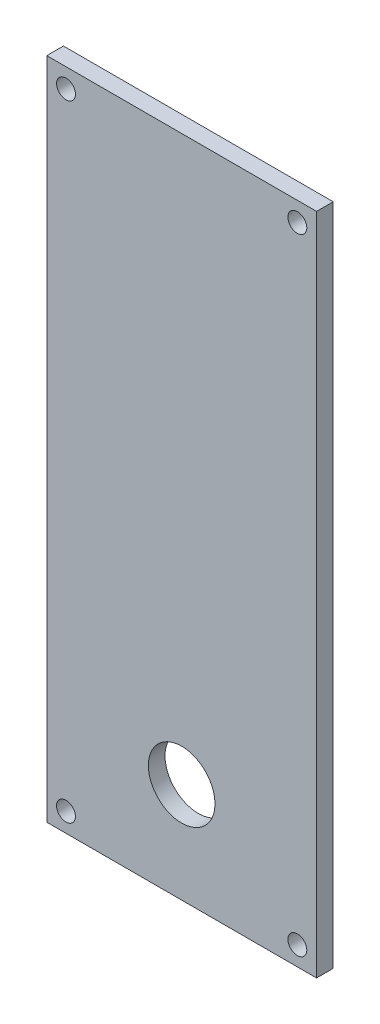
ISO-10303-21;
HEADER;
FILE_DESCRIPTION(('STEP AP214'),'2;1');
FILE_NAME('part.step','',(''),(''),'','','');
FILE_SCHEMA(('AUTOMOTIVE_DESIGN { 1 0 10303 214 1 1 1 1 }'));
ENDSEC;
DATA;
#1=APPLICATION_CONTEXT('core data for automotive mechanical design processes');
#2=APPLICATION_PROTOCOL_DEFINITION('international standard','automotive_design',2000,#1);
#3=PRODUCT_CONTEXT('',#1,'mechanical');
#4=PRODUCT('Part','Part','',(#3));
#5=PRODUCT_RELATED_PRODUCT_CATEGORY('part','',(#4));
#6=PRODUCT_DEFINITION_FORMATION('','',#4);
#7=PRODUCT_DEFINITION_CONTEXT('part definition',#1,'design');
#8=PRODUCT_DEFINITION('design','',#6,#7);
#9=PRODUCT_DEFINITION_SHAPE('','',#8);
#10=(LENGTH_UNIT() NAMED_UNIT(*) SI_UNIT(.MILLI.,.METRE.));
#11=(NAMED_UNIT(*) PLANE_ANGLE_UNIT() SI_UNIT($,.RADIAN.));
#12=(NAMED_UNIT(*) SI_UNIT($,.STERADIAN.) SOLID_ANGLE_UNIT());
#13=UNCERTAINTY_MEASURE_WITH_UNIT(LENGTH_MEASURE(1.E-05),#10,'distance_accuracy_value','');
#14=(GEOMETRIC_REPRESENTATION_CONTEXT(3) GLOBAL_UNCERTAINTY_ASSIGNED_CONTEXT((#13)) GLOBAL_UNIT_ASSIGNED_CONTEXT((#10,
#11,#12)) REPRESENTATION_CONTEXT('',''));
#15=CARTESIAN_POINT('',(0.,0.,0.));
#16=DIRECTION('',(0.,0.,1.));
#17=DIRECTION('',(1.,0.,0.));
#18=AXIS2_PLACEMENT_3D('',#15,#16,#17);
#19=CARTESIAN_POINT('',(204.8,59.8,132.097327625323));
#20=DIRECTION('',(1.,0.,0.));
#21=DIRECTION('',(0.,0.,-1.));
#22=AXIS2_PLACEMENT_3D('',#19,#20,#21);
#23=PLANE('',#22);
#24=DIRECTION('',(0.,1.,0.));
#25=VECTOR('',#24,1.);
#26=CARTESIAN_POINT('',(204.8,59.8,3.));
#27=LINE('',#26,#25);
#28=CARTESIAN_POINT('',(204.8,-59.8,3.));
#29=VERTEX_POINT('',#28);
#30=CARTESIAN_POINT('',(204.8,59.8,3.));
#31=VERTEX_POINT('',#30);
#32=EDGE_CURVE('E52',#29,#31,#27,.T.);
#33=ORIENTED_EDGE('',*,*,#32,.F.);
#34=DIRECTION('',(0.,0.,-1.));
#35=VECTOR('',#34,1.);
#36=CARTESIAN_POINT('',(204.8,-59.8,132.097327625323));
#37=LINE('',#36,#35);
#38=CARTESIAN_POINT('',(204.8,-59.8,0.));
#39=VERTEX_POINT('',#38);
#40=EDGE_CURVE('E81',#29,#39,#37,.T.);
#41=ORIENTED_EDGE('',*,*,#40,.T.);
#42=DIRECTION('',(0.,-1.,0.));
#43=VECTOR('',#42,1.);
#44=CARTESIAN_POINT('',(204.8,59.8,0.));
#45=LINE('',#44,#43);
#46=CARTESIAN_POINT('',(204.8,59.8,0.));
#47=VERTEX_POINT('',#46);
#48=EDGE_CURVE('E85',#47,#39,#45,.T.);
#49=ORIENTED_EDGE('',*,*,#48,.F.);
#50=DIRECTION('',(0.,0.,-1.));
#51=VECTOR('',#50,1.);
#52=CARTESIAN_POINT('',(204.8,59.8,132.097327625323));
#53=LINE('',#52,#51);
#54=EDGE_CURVE('E113',#31,#47,#53,.T.);
#55=ORIENTED_EDGE('',*,*,#54,.F.);
#56=EDGE_LOOP('',(#33,#41,#49,#55));
#57=FACE_BOUND('',#56,.T.);
#58=ADVANCED_FACE('F43',(#57),#23,.T.);
#59=CARTESIAN_POINT('',(156.2,59.8,132.097327625323));
#60=DIRECTION('',(0.,1.,0.));
#61=DIRECTION('',(0.,0.,1.));
#62=AXIS2_PLACEMENT_3D('',#59,#60,#61);
#63=PLANE('',#62);
#64=DIRECTION('',(-1.,0.,0.));
#65=VECTOR('',#64,1.);
#66=CARTESIAN_POINT('',(156.2,59.8,3.));
#67=LINE('',#66,#65);
#68=CARTESIAN_POINT('',(156.2,59.8,3.));
#69=VERTEX_POINT('',#68);
#70=EDGE_CURVE('E59',#31,#69,#67,.T.);
#71=ORIENTED_EDGE('',*,*,#70,.F.);
#72=ORIENTED_EDGE('',*,*,#54,.T.);
#73=DIRECTION('',(1.,0.,0.));
#74=VECTOR('',#73,1.);
#75=CARTESIAN_POINT('',(156.2,59.8,0.));
#76=LINE('',#75,#74);
#77=CARTESIAN_POINT('',(156.2,59.8,0.));
#78=VERTEX_POINT('',#77);
#79=EDGE_CURVE('E90',#78,#47,#76,.T.);
#80=ORIENTED_EDGE('',*,*,#79,.F.);
#81=DIRECTION('',(0.,0.,-1.));
#82=VECTOR('',#81,1.);
#83=CARTESIAN_POINT('',(156.2,59.8,132.097327625323));
#84=LINE('',#83,#82);
#85=EDGE_CURVE('E116',#69,#78,#84,.T.);
#86=ORIENTED_EDGE('',*,*,#85,.F.);
#87=EDGE_LOOP('',(#71,#72,#80,#86));
#88=FACE_BOUND('',#87,.T.);
#89=ADVANCED_FACE('F142',(#88),#63,.T.);
#90=CARTESIAN_POINT('',(156.2,59.8,132.097327625323));
#91=DIRECTION('',(-1.,0.,0.));
#92=DIRECTION('',(0.,0.,1.));
#93=AXIS2_PLACEMENT_3D('',#90,#91,#92);
#94=PLANE('',#93);
#95=DIRECTION('',(0.,-1.,0.));
#96=VECTOR('',#95,1.);
#97=CARTESIAN_POINT('',(156.2,59.8,3.));
#98=LINE('',#97,#96);
#99=CARTESIAN_POINT('',(156.2,-59.8,3.));
#100=VERTEX_POINT('',#99);
#101=EDGE_CURVE('E115',#69,#100,#98,.T.);
#102=ORIENTED_EDGE('',*,*,#101,.F.);
#103=ORIENTED_EDGE('',*,*,#85,.T.);
#104=DIRECTION('',(0.,1.,0.));
#105=VECTOR('',#104,1.);
#106=CARTESIAN_POINT('',(156.2,59.8,0.));
#107=LINE('',#106,#105);
#108=CARTESIAN_POINT('',(156.2,-59.8,0.));
#109=VERTEX_POINT('',#108);
#110=EDGE_CURVE('E99',#109,#78,#107,.T.);
#111=ORIENTED_EDGE('',*,*,#110,.F.);
#112=DIRECTION('',(0.,0.,-1.));
#113=VECTOR('',#112,1.);
#114=CARTESIAN_POINT('',(156.2,-59.8,132.097327625323));
#115=LINE('',#114,#113);
#116=EDGE_CURVE('E89',#100,#109,#115,.T.);
#117=ORIENTED_EDGE('',*,*,#116,.F.);
#118=EDGE_LOOP('',(#102,#103,#111,#117));
#119=FACE_BOUND('',#118,.T.);
#120=ADVANCED_FACE('F144',(#119),#94,.T.);
#121=CARTESIAN_POINT('',(204.8,-59.8,132.097327625323));
#122=DIRECTION('',(0.,-1.,0.));
#123=DIRECTION('',(1.,0.,0.));
#124=AXIS2_PLACEMENT_3D('',#121,#122,#123);
#125=PLANE('',#124);
#126=DIRECTION('',(1.,0.,0.));
#127=VECTOR('',#126,1.);
#128=CARTESIAN_POINT('',(204.8,-59.8,3.));
#129=LINE('',#128,#127);
#130=EDGE_CURVE('E11',#100,#29,#129,.T.);
#131=ORIENTED_EDGE('',*,*,#130,.F.);
#132=ORIENTED_EDGE('',*,*,#116,.T.);
#133=DIRECTION('',(-1.,0.,0.));
#134=VECTOR('',#133,1.);
#135=CARTESIAN_POINT('',(204.8,-59.8,0.));
#136=LINE('',#135,#134);
#137=EDGE_CURVE('E93',#39,#109,#136,.T.);
#138=ORIENTED_EDGE('',*,*,#137,.F.);
#139=ORIENTED_EDGE('',*,*,#40,.F.);
#140=EDGE_LOOP('',(#131,#132,#138,#139));
#141=FACE_BOUND('',#140,.T.);
#142=ADVANCED_FACE('F94',(#141),#125,.T.);
#143=CARTESIAN_POINT('',(0.,0.,0.));
#144=DIRECTION('',(0.,0.,-1.));
#145=DIRECTION('',(-1.,0.,0.));
#146=AXIS2_PLACEMENT_3D('',#143,#144,#145);
#147=PLANE('',#146);
#148=CARTESIAN_POINT('',(159.661165235168,56.3388347648319,0.));
#149=DIRECTION('',(0.,0.,-1.));
#150=DIRECTION('',(-1.,0.,0.));
#151=AXIS2_PLACEMENT_3D('',#148,#149,#150);
#152=CIRCLE('',#151,1.70000000000001);
#153=CARTESIAN_POINT('',(157.961165235168,56.3388347648319,0.));
#154=VERTEX_POINT('',#153);
#155=EDGE_CURVE('E244',#154,#154,#152,.T.);
#156=ORIENTED_EDGE('',*,*,#155,.F.);
#157=EDGE_LOOP('',(#156));
#158=FACE_BOUND('',#157,.T.);
#159=CARTESIAN_POINT('',(159.661165235168,-56.3388347648319,0.));
#160=DIRECTION('',(0.,0.,-1.));
#161=DIRECTION('',(-1.,0.,0.));
#162=AXIS2_PLACEMENT_3D('',#159,#160,#161);
#163=CIRCLE('',#162,1.70000000000001);
#164=CARTESIAN_POINT('',(157.961165235168,-56.3388347648319,0.));
#165=VERTEX_POINT('',#164);
#166=EDGE_CURVE('E245',#165,#165,#163,.T.);
#167=ORIENTED_EDGE('',*,*,#166,.F.);
#168=EDGE_LOOP('',(#167));
#169=FACE_BOUND('',#168,.T.);
#170=CARTESIAN_POINT('',(201.338834764832,-56.3388347648319,0.));
#171=DIRECTION('',(0.,0.,-1.));
#172=DIRECTION('',(-1.,0.,0.));
#173=AXIS2_PLACEMENT_3D('',#170,#171,#172);
#174=CIRCLE('',#173,1.70000000000001);
#175=CARTESIAN_POINT('',(199.638834764832,-56.3388347648319,0.));
#176=VERTEX_POINT('',#175);
#177=EDGE_CURVE('E247',#176,#176,#174,.T.);
#178=ORIENTED_EDGE('',*,*,#177,.F.);
#179=EDGE_LOOP('',(#178));
#180=FACE_BOUND('',#179,.T.);
#181=CARTESIAN_POINT('',(201.338834764832,56.3388347648319,0.));
#182=DIRECTION('',(0.,0.,-1.));
#183=DIRECTION('',(-1.,0.,0.));
#184=AXIS2_PLACEMENT_3D('',#181,#182,#183);
#185=CIRCLE('',#184,1.70000000000001);
#186=CARTESIAN_POINT('',(199.638834764832,56.3388347648319,0.));
#187=VERTEX_POINT('',#186);
#188=EDGE_CURVE('E123',#187,#187,#185,.T.);
#189=ORIENTED_EDGE('',*,*,#188,.F.);
#190=EDGE_LOOP('',(#189));
#191=FACE_BOUND('',#190,.T.);
#192=CARTESIAN_POINT('',(180.5,-41.786923320957,0.));
#193=DIRECTION('',(0.,0.,-1.));
#194=DIRECTION('',(-1.,0.,0.));
#195=AXIS2_PLACEMENT_3D('',#192,#193,#194);
#196=CIRCLE('',#195,6.00000000000002);
#197=CARTESIAN_POINT('',(174.5,-41.786923320957,0.));
#198=VERTEX_POINT('',#197);
#199=EDGE_CURVE('E106',#198,#198,#196,.T.);
#200=ORIENTED_EDGE('',*,*,#199,.F.);
#201=EDGE_LOOP('',(#200));
#202=FACE_BOUND('',#201,.T.);
#203=ORIENTED_EDGE('',*,*,#48,.T.);
#204=ORIENTED_EDGE('',*,*,#137,.T.);
#205=ORIENTED_EDGE('',*,*,#110,.T.);
#206=ORIENTED_EDGE('',*,*,#79,.T.);
#207=EDGE_LOOP('',(#203,#204,#205,#206));
#208=FACE_BOUND('',#207,.T.);
#209=ADVANCED_FACE('F101',(#158,#169,#180,#191,#202,#208),#147,.T.);
#210=CARTESIAN_POINT('',(0.,0.,3.));
#211=DIRECTION('',(0.,0.,-1.));
#212=DIRECTION('',(-1.,0.,0.));
#213=AXIS2_PLACEMENT_3D('',#210,#211,#212);
#214=PLANE('',#213);
#215=CARTESIAN_POINT('',(159.661165235168,56.3388347648319,3.));
#216=DIRECTION('',(0.,0.,-1.));
#217=DIRECTION('',(-1.,0.,0.));
#218=AXIS2_PLACEMENT_3D('',#215,#216,#217);
#219=CIRCLE('',#218,1.70000000000001);
#220=CARTESIAN_POINT('',(157.961165235168,56.3388347648319,3.));
#221=VERTEX_POINT('',#220);
#222=EDGE_CURVE('E46',#221,#221,#219,.T.);
#223=ORIENTED_EDGE('',*,*,#222,.T.);
#224=EDGE_LOOP('',(#223));
#225=FACE_BOUND('',#224,.T.);
#226=CARTESIAN_POINT('',(159.661165235168,-56.3388347648319,3.));
#227=DIRECTION('',(0.,0.,-1.));
#228=DIRECTION('',(-1.,0.,0.));
#229=AXIS2_PLACEMENT_3D('',#226,#227,#228);
#230=CIRCLE('',#229,1.70000000000001);
#231=CARTESIAN_POINT('',(157.961165235168,-56.3388347648319,3.));
#232=VERTEX_POINT('',#231);
#233=EDGE_CURVE('E125',#232,#232,#230,.T.);
#234=ORIENTED_EDGE('',*,*,#233,.T.);
#235=EDGE_LOOP('',(#234));
#236=FACE_BOUND('',#235,.T.);
#237=CARTESIAN_POINT('',(201.338834764832,-56.3388347648319,3.));
#238=DIRECTION('',(0.,0.,-1.));
#239=DIRECTION('',(-1.,0.,0.));
#240=AXIS2_PLACEMENT_3D('',#237,#238,#239);
#241=CIRCLE('',#240,1.70000000000001);
#242=CARTESIAN_POINT('',(199.638834764832,-56.3388347648319,3.));
#243=VERTEX_POINT('',#242);
#244=EDGE_CURVE('E122',#243,#243,#241,.T.);
#245=ORIENTED_EDGE('',*,*,#244,.T.);
#246=EDGE_LOOP('',(#245));
#247=FACE_BOUND('',#246,.T.);
#248=CARTESIAN_POINT('',(201.338834764832,56.3388347648319,3.));
#249=DIRECTION('',(0.,0.,-1.));
#250=DIRECTION('',(-1.,0.,0.));
#251=AXIS2_PLACEMENT_3D('',#248,#249,#250);
#252=CIRCLE('',#251,1.70000000000001);
#253=CARTESIAN_POINT('',(199.638834764832,56.3388347648319,3.));
#254=VERTEX_POINT('',#253);
#255=EDGE_CURVE('E119',#254,#254,#252,.T.);
#256=ORIENTED_EDGE('',*,*,#255,.T.);
#257=EDGE_LOOP('',(#256));
#258=FACE_BOUND('',#257,.T.);
#259=CARTESIAN_POINT('',(180.5,-41.786923320957,3.));
#260=DIRECTION('',(0.,0.,-1.));
#261=DIRECTION('',(-1.,0.,0.));
#262=AXIS2_PLACEMENT_3D('',#259,#260,#261);
#263=CIRCLE('',#262,6.00000000000002);
#264=CARTESIAN_POINT('',(174.5,-41.786923320957,3.));
#265=VERTEX_POINT('',#264);
#266=EDGE_CURVE('E103',#265,#265,#263,.T.);
#267=ORIENTED_EDGE('',*,*,#266,.T.);
#268=EDGE_LOOP('',(#267));
#269=FACE_BOUND('',#268,.T.);
#270=ORIENTED_EDGE('',*,*,#32,.T.);
#271=ORIENTED_EDGE('',*,*,#70,.T.);
#272=ORIENTED_EDGE('',*,*,#101,.T.);
#273=ORIENTED_EDGE('',*,*,#130,.T.);
#274=EDGE_LOOP('',(#270,#271,#272,#273));
#275=FACE_BOUND('',#274,.T.);
#276=ADVANCED_FACE('F139',(#225,#236,#247,#258,#269,#275),#214,.F.);
#277=CARTESIAN_POINT('',(180.5,-41.786923320957,5.));
#278=DIRECTION('',(0.,0.,-1.));
#279=DIRECTION('',(-1.,0.,0.));
#280=AXIS2_PLACEMENT_3D('',#277,#278,#279);
#281=CYLINDRICAL_SURFACE('',#280,6.00000000000002);
#282=ORIENTED_EDGE('',*,*,#199,.T.);
#283=EDGE_LOOP('',(#282));
#284=FACE_BOUND('',#283,.T.);
#285=ORIENTED_EDGE('',*,*,#266,.F.);
#286=EDGE_LOOP('',(#285));
#287=FACE_BOUND('',#286,.T.);
#288=ADVANCED_FACE('F187',(#284,#287),#281,.F.);
#289=CARTESIAN_POINT('',(201.338834764832,56.3388347648319,5.));
#290=DIRECTION('',(0.,0.,-1.));
#291=DIRECTION('',(-1.,0.,0.));
#292=AXIS2_PLACEMENT_3D('',#289,#290,#291);
#293=CYLINDRICAL_SURFACE('',#292,1.70000000000001);
#294=ORIENTED_EDGE('',*,*,#188,.T.);
#295=EDGE_LOOP('',(#294));
#296=FACE_BOUND('',#295,.T.);
#297=ORIENTED_EDGE('',*,*,#255,.F.);
#298=EDGE_LOOP('',(#297));
#299=FACE_BOUND('',#298,.T.);
#300=ADVANCED_FACE('F195',(#296,#299),#293,.F.);
#301=CARTESIAN_POINT('',(201.338834764832,-56.3388347648319,5.));
#302=DIRECTION('',(0.,0.,-1.));
#303=DIRECTION('',(-1.,0.,0.));
#304=AXIS2_PLACEMENT_3D('',#301,#302,#303);
#305=CYLINDRICAL_SURFACE('',#304,1.70000000000001);
#306=ORIENTED_EDGE('',*,*,#177,.T.);
#307=EDGE_LOOP('',(#306));
#308=FACE_BOUND('',#307,.T.);
#309=ORIENTED_EDGE('',*,*,#244,.F.);
#310=EDGE_LOOP('',(#309));
#311=FACE_BOUND('',#310,.T.);
#312=ADVANCED_FACE('F203',(#308,#311),#305,.F.);
#313=CARTESIAN_POINT('',(159.661165235168,-56.3388347648319,5.));
#314=DIRECTION('',(0.,0.,-1.));
#315=DIRECTION('',(-1.,0.,0.));
#316=AXIS2_PLACEMENT_3D('',#313,#314,#315);
#317=CYLINDRICAL_SURFACE('',#316,1.70000000000001);
#318=ORIENTED_EDGE('',*,*,#166,.T.);
#319=EDGE_LOOP('',(#318));
#320=FACE_BOUND('',#319,.T.);
#321=ORIENTED_EDGE('',*,*,#233,.F.);
#322=EDGE_LOOP('',(#321));
#323=FACE_BOUND('',#322,.T.);
#324=ADVANCED_FACE('F212',(#320,#323),#317,.F.);
#325=CARTESIAN_POINT('',(159.661165235168,56.3388347648319,5.));
#326=DIRECTION('',(0.,0.,-1.));
#327=DIRECTION('',(-1.,0.,0.));
#328=AXIS2_PLACEMENT_3D('',#325,#326,#327);
#329=CYLINDRICAL_SURFACE('',#328,1.70000000000001);
#330=ORIENTED_EDGE('',*,*,#155,.T.);
#331=EDGE_LOOP('',(#330));
#332=FACE_BOUND('',#331,.T.);
#333=ORIENTED_EDGE('',*,*,#222,.F.);
#334=EDGE_LOOP('',(#333));
#335=FACE_BOUND('',#334,.T.);
#336=ADVANCED_FACE('F221',(#332,#335),#329,.F.);
#337=CLOSED_SHELL('',(#58,#89,#120,#142,#209,#276,#288,#300,#312,#324,#336));
#338=MANIFOLD_SOLID_BREP('B2',#337);
#339=ADVANCED_BREP_SHAPE_REPRESENTATION('',(#18,#338),#14);
#340=SHAPE_DEFINITION_REPRESENTATION(#9,#339);
ENDSEC;
END-ISO-10303-21;
